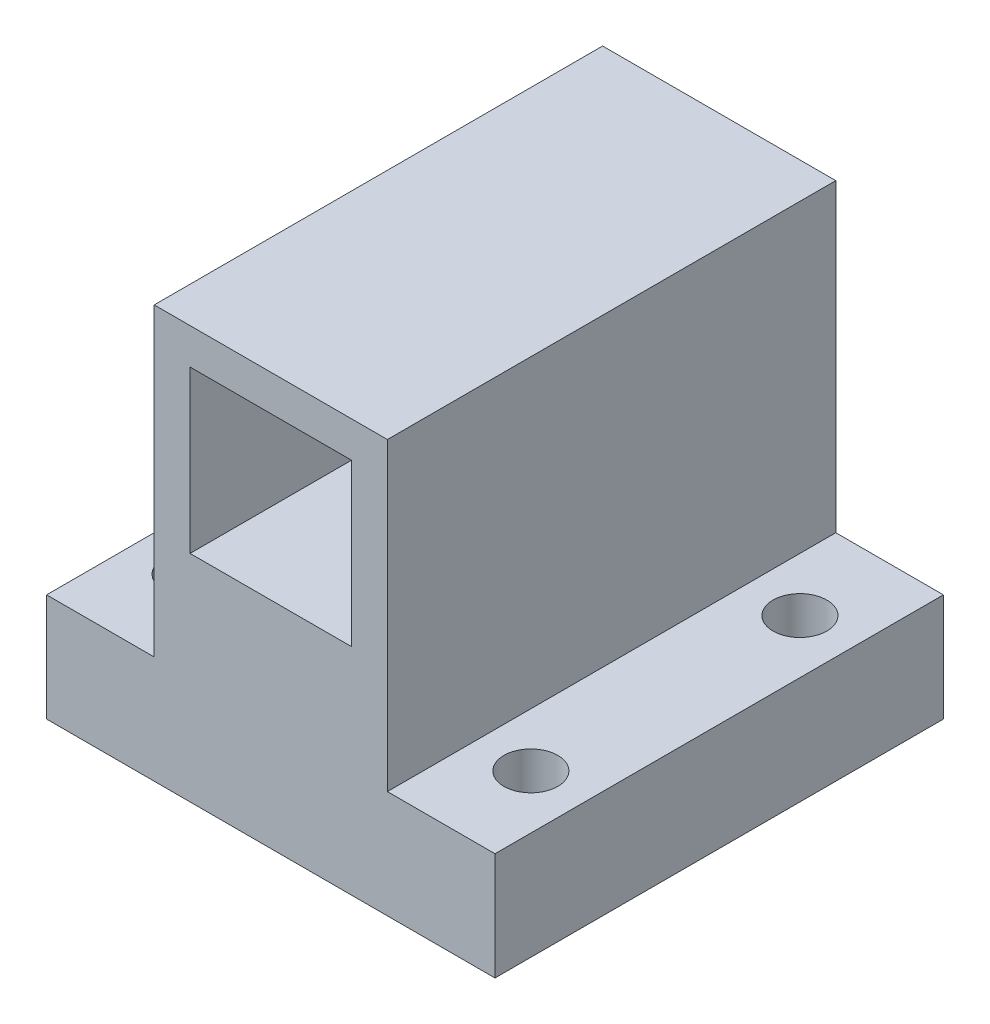
ISO-10303-21;
HEADER;
FILE_DESCRIPTION(('STEP AP214'),'2;1');
FILE_NAME('part.step','',(''),(''),'','','');
FILE_SCHEMA(('AUTOMOTIVE_DESIGN { 1 0 10303 214 1 1 1 1 }'));
ENDSEC;
DATA;
#1=APPLICATION_CONTEXT('core data for automotive mechanical design processes');
#2=APPLICATION_PROTOCOL_DEFINITION('international standard','automotive_design',2000,#1);
#3=PRODUCT_CONTEXT('',#1,'mechanical');
#4=PRODUCT('Part','Part','',(#3));
#5=PRODUCT_RELATED_PRODUCT_CATEGORY('part','',(#4));
#6=PRODUCT_DEFINITION_FORMATION('','',#4);
#7=PRODUCT_DEFINITION_CONTEXT('part definition',#1,'design');
#8=PRODUCT_DEFINITION('design','',#6,#7);
#9=PRODUCT_DEFINITION_SHAPE('','',#8);
#10=(LENGTH_UNIT() NAMED_UNIT(*) SI_UNIT(.MILLI.,.METRE.));
#11=(NAMED_UNIT(*) PLANE_ANGLE_UNIT() SI_UNIT($,.RADIAN.));
#12=(NAMED_UNIT(*) SI_UNIT($,.STERADIAN.) SOLID_ANGLE_UNIT());
#13=UNCERTAINTY_MEASURE_WITH_UNIT(LENGTH_MEASURE(1.E-05),#10,'distance_accuracy_value','');
#14=(GEOMETRIC_REPRESENTATION_CONTEXT(3) GLOBAL_UNCERTAINTY_ASSIGNED_CONTEXT((#13)) GLOBAL_UNIT_ASSIGNED_CONTEXT((#10,
#11,#12)) REPRESENTATION_CONTEXT('',''));
#15=CARTESIAN_POINT('',(0.,0.,0.));
#16=DIRECTION('',(0.,0.,1.));
#17=DIRECTION('',(1.,0.,0.));
#18=AXIS2_PLACEMENT_3D('',#15,#16,#17);
#19=CARTESIAN_POINT('',(0.,0.,0.));
#20=DIRECTION('',(0.,1.,0.));
#21=DIRECTION('',(0.,0.,1.));
#22=AXIS2_PLACEMENT_3D('',#19,#20,#21);
#23=PLANE('',#22);
#24=CARTESIAN_POINT('',(-50.4586617117125,0.,37.4210062958674));
#25=DIRECTION('',(0.,-1.,0.));
#26=DIRECTION('',(0.,0.,1.));
#27=AXIS2_PLACEMENT_3D('',#24,#25,#26);
#28=CIRCLE('',#27,1.5);
#29=CARTESIAN_POINT('',(-50.4586617117125,0.,38.9210062958674));
#30=VERTEX_POINT('',#29);
#31=EDGE_CURVE('E221',#30,#30,#28,.T.);
#32=ORIENTED_EDGE('',*,*,#31,.F.);
#33=EDGE_LOOP('',(#32));
#34=FACE_BOUND('',#33,.T.);
#35=CARTESIAN_POINT('',(-69.4586617117125,0.,52.4210062958674));
#36=DIRECTION('',(0.,1.,0.));
#37=DIRECTION('',(0.,0.,1.));
#38=AXIS2_PLACEMENT_3D('',#35,#36,#37);
#39=CIRCLE('',#38,1.5);
#40=CARTESIAN_POINT('',(-69.4586617117125,0.,53.9210062958674));
#41=VERTEX_POINT('',#40);
#42=EDGE_CURVE('E229',#41,#41,#39,.T.);
#43=ORIENTED_EDGE('',*,*,#42,.T.);
#44=EDGE_LOOP('',(#43));
#45=FACE_BOUND('',#44,.T.);
#46=CARTESIAN_POINT('',(-69.4586617117125,0.,37.4210062958674));
#47=DIRECTION('',(0.,1.,0.));
#48=DIRECTION('',(0.,0.,1.));
#49=AXIS2_PLACEMENT_3D('',#46,#47,#48);
#50=CIRCLE('',#49,1.5);
#51=CARTESIAN_POINT('',(-69.4586617117125,0.,38.9210062958674));
#52=VERTEX_POINT('',#51);
#53=EDGE_CURVE('E237',#52,#52,#50,.T.);
#54=ORIENTED_EDGE('',*,*,#53,.T.);
#55=EDGE_LOOP('',(#54));
#56=FACE_BOUND('',#55,.T.);
#57=DIRECTION('',(0.,0.,-1.));
#58=VECTOR('',#57,1.);
#59=CARTESIAN_POINT('',(-47.4586617117125,0.,32.4210062958674));
#60=LINE('',#59,#58);
#61=CARTESIAN_POINT('',(-47.4586617117125,0.,57.4210062958674));
#62=VERTEX_POINT('',#61);
#63=CARTESIAN_POINT('',(-47.4586617117125,0.,32.4210062958674));
#64=VERTEX_POINT('',#63);
#65=EDGE_CURVE('E266',#62,#64,#60,.T.);
#66=ORIENTED_EDGE('',*,*,#65,.F.);
#67=DIRECTION('',(1.,0.,0.));
#68=VECTOR('',#67,1.);
#69=CARTESIAN_POINT('',(-72.4586617117125,0.,57.4210062958674));
#70=LINE('',#69,#68);
#71=CARTESIAN_POINT('',(-72.4586617117125,0.,57.4210062958674));
#72=VERTEX_POINT('',#71);
#73=EDGE_CURVE('E271',#72,#62,#70,.T.);
#74=ORIENTED_EDGE('',*,*,#73,.F.);
#75=DIRECTION('',(0.,0.,1.));
#76=VECTOR('',#75,1.);
#77=CARTESIAN_POINT('',(-72.4586617117125,0.,32.4210062958674));
#78=LINE('',#77,#76);
#79=CARTESIAN_POINT('',(-72.4586617117125,0.,32.4210062958674));
#80=VERTEX_POINT('',#79);
#81=EDGE_CURVE('E265',#80,#72,#78,.T.);
#82=ORIENTED_EDGE('',*,*,#81,.F.);
#83=DIRECTION('',(-1.,0.,0.));
#84=VECTOR('',#83,1.);
#85=CARTESIAN_POINT('',(-72.4586617117125,0.,32.4210062958674));
#86=LINE('',#85,#84);
#87=EDGE_CURVE('E259',#64,#80,#86,.T.);
#88=ORIENTED_EDGE('',*,*,#87,.F.);
#89=EDGE_LOOP('',(#66,#74,#82,#88));
#90=FACE_BOUND('',#89,.T.);
#91=CARTESIAN_POINT('',(-50.4586617117125,0.,52.4210062958674));
#92=DIRECTION('',(0.,-1.,0.));
#93=DIRECTION('',(0.,0.,1.));
#94=AXIS2_PLACEMENT_3D('',#91,#92,#93);
#95=CIRCLE('',#94,1.5);
#96=CARTESIAN_POINT('',(-50.4586617117125,0.,53.9210062958674));
#97=VERTEX_POINT('',#96);
#98=EDGE_CURVE('E213',#97,#97,#95,.T.);
#99=ORIENTED_EDGE('',*,*,#98,.F.);
#100=EDGE_LOOP('',(#99));
#101=FACE_BOUND('',#100,.T.);
#102=ADVANCED_FACE('F46',(#34,#45,#56,#90,#101),#23,.F.);
#103=CARTESIAN_POINT('',(0.,6.,0.));
#104=DIRECTION('',(0.,-1.,0.));
#105=DIRECTION('',(0.,0.,-1.));
#106=AXIS2_PLACEMENT_3D('',#103,#104,#105);
#107=PLANE('',#106);
#108=CARTESIAN_POINT('',(-50.4586617117125,6.,37.4210062958674));
#109=DIRECTION('',(0.,-1.,0.));
#110=DIRECTION('',(0.,0.,1.));
#111=AXIS2_PLACEMENT_3D('',#108,#109,#110);
#112=CIRCLE('',#111,1.5);
#113=CARTESIAN_POINT('',(-50.4586617117125,6.,38.9210062958674));
#114=VERTEX_POINT('',#113);
#115=EDGE_CURVE('E217',#114,#114,#112,.T.);
#116=ORIENTED_EDGE('',*,*,#115,.T.);
#117=EDGE_LOOP('',(#116));
#118=FACE_BOUND('',#117,.T.);
#119=DIRECTION('',(-1.,0.,0.));
#120=VECTOR('',#119,1.);
#121=CARTESIAN_POINT('',(-53.4586617117125,6.,32.4210062958674));
#122=LINE('',#121,#120);
#123=CARTESIAN_POINT('',(-47.4586617117125,6.,32.4210062958674));
#124=VERTEX_POINT('',#123);
#125=CARTESIAN_POINT('',(-53.4586617117125,6.,32.4210062958674));
#126=VERTEX_POINT('',#125);
#127=EDGE_CURVE('E245',#124,#126,#122,.T.);
#128=ORIENTED_EDGE('',*,*,#127,.T.);
#129=DIRECTION('',(0.,0.,1.));
#130=VECTOR('',#129,1.);
#131=CARTESIAN_POINT('',(-53.4586617117125,6.,57.4210062958674));
#132=LINE('',#131,#130);
#133=CARTESIAN_POINT('',(-53.4586617117125,6.,57.4210062958674));
#134=VERTEX_POINT('',#133);
#135=EDGE_CURVE('E250',#126,#134,#132,.T.);
#136=ORIENTED_EDGE('',*,*,#135,.T.);
#137=DIRECTION('',(1.,0.,0.));
#138=VECTOR('',#137,1.);
#139=CARTESIAN_POINT('',(-47.4586617117125,6.,57.4210062958674));
#140=LINE('',#139,#138);
#141=CARTESIAN_POINT('',(-47.4586617117125,6.,57.4210062958674));
#142=VERTEX_POINT('',#141);
#143=EDGE_CURVE('E346',#134,#142,#140,.T.);
#144=ORIENTED_EDGE('',*,*,#143,.T.);
#145=DIRECTION('',(0.,0.,-1.));
#146=VECTOR('',#145,1.);
#147=CARTESIAN_POINT('',(-47.4586617117125,6.,32.4210062958674));
#148=LINE('',#147,#146);
#149=EDGE_CURVE('E352',#142,#124,#148,.T.);
#150=ORIENTED_EDGE('',*,*,#149,.T.);
#151=EDGE_LOOP('',(#128,#136,#144,#150));
#152=FACE_BOUND('',#151,.T.);
#153=CARTESIAN_POINT('',(-50.4586617117125,6.,52.4210062958674));
#154=DIRECTION('',(0.,-1.,0.));
#155=DIRECTION('',(0.,0.,1.));
#156=AXIS2_PLACEMENT_3D('',#153,#154,#155);
#157=CIRCLE('',#156,1.5);
#158=CARTESIAN_POINT('',(-50.4586617117125,6.,53.9210062958674));
#159=VERTEX_POINT('',#158);
#160=EDGE_CURVE('E207',#159,#159,#157,.T.);
#161=ORIENTED_EDGE('',*,*,#160,.T.);
#162=EDGE_LOOP('',(#161));
#163=FACE_BOUND('',#162,.T.);
#164=ADVANCED_FACE('F362',(#118,#152,#163),#107,.F.);
#165=CARTESIAN_POINT('',(-47.4586617117125,23.,32.4210062958674));
#166=DIRECTION('',(-1.,0.,0.));
#167=DIRECTION('',(0.,0.,1.));
#168=AXIS2_PLACEMENT_3D('',#165,#166,#167);
#169=PLANE('',#168);
#170=DIRECTION('',(0.,-1.,0.));
#171=VECTOR('',#170,1.);
#172=CARTESIAN_POINT('',(-47.4586617117125,23.,32.4210062958674));
#173=LINE('',#172,#171);
#174=EDGE_CURVE('E12',#124,#64,#173,.T.);
#175=ORIENTED_EDGE('',*,*,#174,.F.);
#176=ORIENTED_EDGE('',*,*,#149,.F.);
#177=DIRECTION('',(0.,-1.,0.));
#178=VECTOR('',#177,1.);
#179=CARTESIAN_POINT('',(-47.4586617117125,23.,57.4210062958674));
#180=LINE('',#179,#178);
#181=EDGE_CURVE('E276',#142,#62,#180,.T.);
#182=ORIENTED_EDGE('',*,*,#181,.T.);
#183=ORIENTED_EDGE('',*,*,#65,.T.);
#184=EDGE_LOOP('',(#175,#176,#182,#183));
#185=FACE_BOUND('',#184,.T.);
#186=ADVANCED_FACE('F48',(#185),#169,.F.);
#187=CARTESIAN_POINT('',(-72.4586617117125,23.,32.4210062958674));
#188=DIRECTION('',(0.,0.,1.));
#189=DIRECTION('',(1.,0.,0.));
#190=AXIS2_PLACEMENT_3D('',#187,#188,#189);
#191=PLANE('',#190);
#192=CARTESIAN_POINT('',(-59.9586617117125,16.5,32.4210062958674));
#193=DIRECTION('',(0.,0.,1.));
#194=DIRECTION('',(1.,0.,0.));
#195=AXIS2_PLACEMENT_3D('',#192,#193,#194);
#196=CIRCLE('',#195,3.1);
#197=CARTESIAN_POINT('',(-56.8586617117125,16.5,32.4210062958674));
#198=VERTEX_POINT('',#197);
#199=EDGE_CURVE('E178',#198,#198,#196,.T.);
#200=ORIENTED_EDGE('',*,*,#199,.T.);
#201=EDGE_LOOP('',(#200));
#202=FACE_BOUND('',#201,.T.);
#203=DIRECTION('',(-1.,0.,0.));
#204=VECTOR('',#203,1.);
#205=CARTESIAN_POINT('',(-72.4586617117125,23.,32.4210062958674));
#206=LINE('',#205,#204);
#207=CARTESIAN_POINT('',(-53.4586617117125,23.,32.4210062958674));
#208=VERTEX_POINT('',#207);
#209=CARTESIAN_POINT('',(-66.4586617117125,23.,32.4210062958674));
#210=VERTEX_POINT('',#209);
#211=EDGE_CURVE('E275',#208,#210,#206,.T.);
#212=ORIENTED_EDGE('',*,*,#211,.F.);
#213=DIRECTION('',(0.,1.,0.));
#214=VECTOR('',#213,1.);
#215=CARTESIAN_POINT('',(-53.4586617117125,6.,32.4210062958674));
#216=LINE('',#215,#214);
#217=EDGE_CURVE('E74',#126,#208,#216,.T.);
#218=ORIENTED_EDGE('',*,*,#217,.F.);
#219=ORIENTED_EDGE('',*,*,#127,.F.);
#220=ORIENTED_EDGE('',*,*,#174,.T.);
#221=ORIENTED_EDGE('',*,*,#87,.T.);
#222=DIRECTION('',(0.,-1.,0.));
#223=VECTOR('',#222,1.);
#224=CARTESIAN_POINT('',(-72.4586617117125,23.,32.4210062958674));
#225=LINE('',#224,#223);
#226=CARTESIAN_POINT('',(-72.4586617117125,6.,32.4210062958674));
#227=VERTEX_POINT('',#226);
#228=EDGE_CURVE('E56',#227,#80,#225,.T.);
#229=ORIENTED_EDGE('',*,*,#228,.F.);
#230=DIRECTION('',(-1.,0.,0.));
#231=VECTOR('',#230,1.);
#232=CARTESIAN_POINT('',(-72.4586617117125,6.,32.4210062958674));
#233=LINE('',#232,#231);
#234=CARTESIAN_POINT('',(-66.4586617117125,6.,32.4210062958674));
#235=VERTEX_POINT('',#234);
#236=EDGE_CURVE('E321',#235,#227,#233,.T.);
#237=ORIENTED_EDGE('',*,*,#236,.F.);
#238=DIRECTION('',(0.,1.,0.));
#239=VECTOR('',#238,1.);
#240=CARTESIAN_POINT('',(-66.4586617117125,6.,32.4210062958674));
#241=LINE('',#240,#239);
#242=EDGE_CURVE('E330',#235,#210,#241,.T.);
#243=ORIENTED_EDGE('',*,*,#242,.T.);
#244=EDGE_LOOP('',(#212,#218,#219,#220,#221,#229,#237,#243));
#245=FACE_BOUND('',#244,.T.);
#246=ADVANCED_FACE('F297',(#202,#245),#191,.F.);
#247=CARTESIAN_POINT('',(-72.4586617117125,23.,32.4210062958674));
#248=DIRECTION('',(1.,0.,0.));
#249=DIRECTION('',(0.,0.,-1.));
#250=AXIS2_PLACEMENT_3D('',#247,#248,#249);
#251=PLANE('',#250);
#252=DIRECTION('',(0.,-1.,0.));
#253=VECTOR('',#252,1.);
#254=CARTESIAN_POINT('',(-72.4586617117125,23.,57.4210062958674));
#255=LINE('',#254,#253);
#256=CARTESIAN_POINT('',(-72.4586617117125,6.,57.4210062958674));
#257=VERTEX_POINT('',#256);
#258=EDGE_CURVE('E279',#257,#72,#255,.T.);
#259=ORIENTED_EDGE('',*,*,#258,.F.);
#260=DIRECTION('',(0.,0.,1.));
#261=VECTOR('',#260,1.);
#262=CARTESIAN_POINT('',(-72.4586617117125,6.,57.4210062958674));
#263=LINE('',#262,#261);
#264=EDGE_CURVE('E291',#227,#257,#263,.T.);
#265=ORIENTED_EDGE('',*,*,#264,.F.);
#266=ORIENTED_EDGE('',*,*,#228,.T.);
#267=ORIENTED_EDGE('',*,*,#81,.T.);
#268=EDGE_LOOP('',(#259,#265,#266,#267));
#269=FACE_BOUND('',#268,.T.);
#270=ADVANCED_FACE('F288',(#269),#251,.F.);
#271=CARTESIAN_POINT('',(-72.4586617117125,23.,57.4210062958674));
#272=DIRECTION('',(0.,0.,-1.));
#273=DIRECTION('',(-1.,0.,0.));
#274=AXIS2_PLACEMENT_3D('',#271,#272,#273);
#275=PLANE('',#274);
#276=DIRECTION('',(1.,0.,0.));
#277=VECTOR('',#276,1.);
#278=CARTESIAN_POINT('',(-55.4586617117125,12.,57.4210062958674));
#279=LINE('',#278,#277);
#280=CARTESIAN_POINT('',(-64.4586617117125,12.,57.4210062958674));
#281=VERTEX_POINT('',#280);
#282=CARTESIAN_POINT('',(-55.4586617117125,12.,57.4210062958674));
#283=VERTEX_POINT('',#282);
#284=EDGE_CURVE('E198',#281,#283,#279,.T.);
#285=ORIENTED_EDGE('',*,*,#284,.F.);
#286=DIRECTION('',(0.,-1.,0.));
#287=VECTOR('',#286,1.);
#288=CARTESIAN_POINT('',(-64.4586617117125,12.,57.4210062958674));
#289=LINE('',#288,#287);
#290=CARTESIAN_POINT('',(-64.4586617117125,21.,57.4210062958674));
#291=VERTEX_POINT('',#290);
#292=EDGE_CURVE('E63',#291,#281,#289,.T.);
#293=ORIENTED_EDGE('',*,*,#292,.F.);
#294=DIRECTION('',(-1.,0.,0.));
#295=VECTOR('',#294,1.);
#296=CARTESIAN_POINT('',(-64.4586617117125,21.,57.4210062958674));
#297=LINE('',#296,#295);
#298=CARTESIAN_POINT('',(-55.4586617117125,21.,57.4210062958674));
#299=VERTEX_POINT('',#298);
#300=EDGE_CURVE('E171',#299,#291,#297,.T.);
#301=ORIENTED_EDGE('',*,*,#300,.F.);
#302=DIRECTION('',(0.,1.,0.));
#303=VECTOR('',#302,1.);
#304=CARTESIAN_POINT('',(-55.4586617117125,21.,57.4210062958674));
#305=LINE('',#304,#303);
#306=EDGE_CURVE('E175',#283,#299,#305,.T.);
#307=ORIENTED_EDGE('',*,*,#306,.F.);
#308=EDGE_LOOP('',(#285,#293,#301,#307));
#309=FACE_BOUND('',#308,.T.);
#310=ORIENTED_EDGE('',*,*,#143,.F.);
#311=DIRECTION('',(0.,1.,0.));
#312=VECTOR('',#311,1.);
#313=CARTESIAN_POINT('',(-53.4586617117125,6.,57.4210062958674));
#314=LINE('',#313,#312);
#315=CARTESIAN_POINT('',(-53.4586617117125,23.,57.4210062958674));
#316=VERTEX_POINT('',#315);
#317=EDGE_CURVE('E345',#134,#316,#314,.T.);
#318=ORIENTED_EDGE('',*,*,#317,.T.);
#319=DIRECTION('',(1.,0.,0.));
#320=VECTOR('',#319,1.);
#321=CARTESIAN_POINT('',(-72.4586617117125,23.,57.4210062958674));
#322=LINE('',#321,#320);
#323=CARTESIAN_POINT('',(-66.4586617117125,23.,57.4210062958674));
#324=VERTEX_POINT('',#323);
#325=EDGE_CURVE('E280',#324,#316,#322,.T.);
#326=ORIENTED_EDGE('',*,*,#325,.F.);
#327=DIRECTION('',(0.,1.,0.));
#328=VECTOR('',#327,1.);
#329=CARTESIAN_POINT('',(-66.4586617117125,6.,57.4210062958674));
#330=LINE('',#329,#328);
#331=CARTESIAN_POINT('',(-66.4586617117125,6.,57.4210062958674));
#332=VERTEX_POINT('',#331);
#333=EDGE_CURVE('E313',#332,#324,#330,.T.);
#334=ORIENTED_EDGE('',*,*,#333,.F.);
#335=DIRECTION('',(1.,0.,0.));
#336=VECTOR('',#335,1.);
#337=CARTESIAN_POINT('',(-66.4586617117125,6.,57.4210062958674));
#338=LINE('',#337,#336);
#339=EDGE_CURVE('E311',#257,#332,#338,.T.);
#340=ORIENTED_EDGE('',*,*,#339,.F.);
#341=ORIENTED_EDGE('',*,*,#258,.T.);
#342=ORIENTED_EDGE('',*,*,#73,.T.);
#343=ORIENTED_EDGE('',*,*,#181,.F.);
#344=EDGE_LOOP('',(#310,#318,#326,#334,#340,#341,#342,#343));
#345=FACE_BOUND('',#344,.T.);
#346=ADVANCED_FACE('F307',(#309,#345),#275,.F.);
#347=CARTESIAN_POINT('',(0.,23.,0.));
#348=DIRECTION('',(0.,1.,0.));
#349=DIRECTION('',(0.,0.,1.));
#350=AXIS2_PLACEMENT_3D('',#347,#348,#349);
#351=PLANE('',#350);
#352=DIRECTION('',(0.,0.,1.));
#353=VECTOR('',#352,1.);
#354=CARTESIAN_POINT('',(-53.4586617117125,23.,57.4210062958674));
#355=LINE('',#354,#353);
#356=EDGE_CURVE('E241',#208,#316,#355,.T.);
#357=ORIENTED_EDGE('',*,*,#356,.F.);
#358=ORIENTED_EDGE('',*,*,#211,.T.);
#359=DIRECTION('',(0.,0.,-1.));
#360=VECTOR('',#359,1.);
#361=CARTESIAN_POINT('',(-66.4586617117125,23.,32.4210062958674));
#362=LINE('',#361,#360);
#363=EDGE_CURVE('E323',#324,#210,#362,.T.);
#364=ORIENTED_EDGE('',*,*,#363,.F.);
#365=ORIENTED_EDGE('',*,*,#325,.T.);
#366=EDGE_LOOP('',(#357,#358,#364,#365));
#367=FACE_BOUND('',#366,.T.);
#368=ADVANCED_FACE('F342',(#367),#351,.T.);
#369=CARTESIAN_POINT('',(-66.4586617117125,6.,32.4210062958674));
#370=DIRECTION('',(1.,0.,0.));
#371=DIRECTION('',(0.,0.,-1.));
#372=AXIS2_PLACEMENT_3D('',#369,#370,#371);
#373=PLANE('',#372);
#374=ORIENTED_EDGE('',*,*,#363,.T.);
#375=ORIENTED_EDGE('',*,*,#242,.F.);
#376=DIRECTION('',(0.,0.,-1.));
#377=VECTOR('',#376,1.);
#378=CARTESIAN_POINT('',(-66.4586617117125,6.,32.4210062958674));
#379=LINE('',#378,#377);
#380=EDGE_CURVE('E317',#332,#235,#379,.T.);
#381=ORIENTED_EDGE('',*,*,#380,.F.);
#382=ORIENTED_EDGE('',*,*,#333,.T.);
#383=EDGE_LOOP('',(#374,#375,#381,#382));
#384=FACE_BOUND('',#383,.T.);
#385=ADVANCED_FACE('F376',(#384),#373,.F.);
#386=CARTESIAN_POINT('',(0.,6.,0.));
#387=DIRECTION('',(0.,-1.,0.));
#388=DIRECTION('',(0.,0.,-1.));
#389=AXIS2_PLACEMENT_3D('',#386,#387,#388);
#390=PLANE('',#389);
#391=CARTESIAN_POINT('',(-69.4586617117125,6.,52.4210062958674));
#392=DIRECTION('',(0.,1.,0.));
#393=DIRECTION('',(0.,0.,1.));
#394=AXIS2_PLACEMENT_3D('',#391,#392,#393);
#395=CIRCLE('',#394,1.5);
#396=CARTESIAN_POINT('',(-69.4586617117125,6.,53.9210062958674));
#397=VERTEX_POINT('',#396);
#398=EDGE_CURVE('E225',#397,#397,#395,.T.);
#399=ORIENTED_EDGE('',*,*,#398,.F.);
#400=EDGE_LOOP('',(#399));
#401=FACE_BOUND('',#400,.T.);
#402=CARTESIAN_POINT('',(-69.4586617117125,6.,37.4210062958674));
#403=DIRECTION('',(0.,1.,0.));
#404=DIRECTION('',(0.,0.,1.));
#405=AXIS2_PLACEMENT_3D('',#402,#403,#404);
#406=CIRCLE('',#405,1.5);
#407=CARTESIAN_POINT('',(-69.4586617117125,6.,38.9210062958674));
#408=VERTEX_POINT('',#407);
#409=EDGE_CURVE('E233',#408,#408,#406,.T.);
#410=ORIENTED_EDGE('',*,*,#409,.F.);
#411=EDGE_LOOP('',(#410));
#412=FACE_BOUND('',#411,.T.);
#413=ORIENTED_EDGE('',*,*,#264,.T.);
#414=ORIENTED_EDGE('',*,*,#339,.T.);
#415=ORIENTED_EDGE('',*,*,#380,.T.);
#416=ORIENTED_EDGE('',*,*,#236,.T.);
#417=EDGE_LOOP('',(#413,#414,#415,#416));
#418=FACE_BOUND('',#417,.T.);
#419=ADVANCED_FACE('F367',(#401,#412,#418),#390,.F.);
#420=CARTESIAN_POINT('',(-53.4586617117125,6.,57.4210062958674));
#421=DIRECTION('',(-1.,0.,0.));
#422=DIRECTION('',(0.,0.,1.));
#423=AXIS2_PLACEMENT_3D('',#420,#421,#422);
#424=PLANE('',#423);
#425=ORIENTED_EDGE('',*,*,#356,.T.);
#426=ORIENTED_EDGE('',*,*,#317,.F.);
#427=ORIENTED_EDGE('',*,*,#135,.F.);
#428=ORIENTED_EDGE('',*,*,#217,.T.);
#429=EDGE_LOOP('',(#425,#426,#427,#428));
#430=FACE_BOUND('',#429,.T.);
#431=ADVANCED_FACE('F364',(#430),#424,.F.);
#432=CARTESIAN_POINT('',(-69.4586617117125,0.,37.4210062958674));
#433=DIRECTION('',(0.,1.,0.));
#434=DIRECTION('',(0.,0.,1.));
#435=AXIS2_PLACEMENT_3D('',#432,#433,#434);
#436=CYLINDRICAL_SURFACE('',#435,1.5);
#437=ORIENTED_EDGE('',*,*,#53,.F.);
#438=EDGE_LOOP('',(#437));
#439=FACE_BOUND('',#438,.T.);
#440=ORIENTED_EDGE('',*,*,#409,.T.);
#441=EDGE_LOOP('',(#440));
#442=FACE_BOUND('',#441,.T.);
#443=ADVANCED_FACE('F366',(#439,#442),#436,.F.);
#444=CARTESIAN_POINT('',(-69.4586617117125,0.,52.4210062958674));
#445=DIRECTION('',(0.,1.,0.));
#446=DIRECTION('',(0.,0.,1.));
#447=AXIS2_PLACEMENT_3D('',#444,#445,#446);
#448=CYLINDRICAL_SURFACE('',#447,1.5);
#449=ORIENTED_EDGE('',*,*,#42,.F.);
#450=EDGE_LOOP('',(#449));
#451=FACE_BOUND('',#450,.T.);
#452=ORIENTED_EDGE('',*,*,#398,.T.);
#453=EDGE_LOOP('',(#452));
#454=FACE_BOUND('',#453,.T.);
#455=ADVANCED_FACE('F373',(#451,#454),#448,.F.);
#456=CARTESIAN_POINT('',(-50.4586617117125,0.,37.4210062958674));
#457=DIRECTION('',(0.,1.,0.));
#458=DIRECTION('',(0.,0.,1.));
#459=AXIS2_PLACEMENT_3D('',#456,#457,#458);
#460=CYLINDRICAL_SURFACE('',#459,1.5);
#461=ORIENTED_EDGE('',*,*,#31,.T.);
#462=EDGE_LOOP('',(#461));
#463=FACE_BOUND('',#462,.T.);
#464=ORIENTED_EDGE('',*,*,#115,.F.);
#465=EDGE_LOOP('',(#464));
#466=FACE_BOUND('',#465,.T.);
#467=ADVANCED_FACE('F436',(#463,#466),#460,.F.);
#468=CARTESIAN_POINT('',(-50.4586617117125,0.,52.4210062958674));
#469=DIRECTION('',(0.,1.,0.));
#470=DIRECTION('',(0.,0.,1.));
#471=AXIS2_PLACEMENT_3D('',#468,#469,#470);
#472=CYLINDRICAL_SURFACE('',#471,1.5);
#473=ORIENTED_EDGE('',*,*,#98,.T.);
#474=EDGE_LOOP('',(#473));
#475=FACE_BOUND('',#474,.T.);
#476=ORIENTED_EDGE('',*,*,#160,.F.);
#477=EDGE_LOOP('',(#476));
#478=FACE_BOUND('',#477,.T.);
#479=ADVANCED_FACE('F433',(#475,#478),#472,.F.);
#480=CARTESIAN_POINT('',(-64.4586617117125,12.,34.4210062958674));
#481=DIRECTION('',(-1.,0.,0.));
#482=DIRECTION('',(0.,0.,1.));
#483=AXIS2_PLACEMENT_3D('',#480,#481,#482);
#484=PLANE('',#483);
#485=ORIENTED_EDGE('',*,*,#292,.T.);
#486=DIRECTION('',(0.,0.,1.));
#487=VECTOR('',#486,1.);
#488=CARTESIAN_POINT('',(-64.4586617117125,12.,34.4210062958674));
#489=LINE('',#488,#487);
#490=CARTESIAN_POINT('',(-64.4586617117125,12.,34.4210062958674));
#491=VERTEX_POINT('',#490);
#492=EDGE_CURVE('E146',#491,#281,#489,.T.);
#493=ORIENTED_EDGE('',*,*,#492,.F.);
#494=DIRECTION('',(0.,-1.,0.));
#495=VECTOR('',#494,1.);
#496=CARTESIAN_POINT('',(-64.4586617117125,12.,34.4210062958674));
#497=LINE('',#496,#495);
#498=CARTESIAN_POINT('',(-64.4586617117125,21.,34.4210062958674));
#499=VERTEX_POINT('',#498);
#500=EDGE_CURVE('E150',#499,#491,#497,.T.);
#501=ORIENTED_EDGE('',*,*,#500,.F.);
#502=DIRECTION('',(0.,0.,1.));
#503=VECTOR('',#502,1.);
#504=CARTESIAN_POINT('',(-64.4586617117125,21.,34.4210062958674));
#505=LINE('',#504,#503);
#506=EDGE_CURVE('E204',#499,#291,#505,.T.);
#507=ORIENTED_EDGE('',*,*,#506,.T.);
#508=EDGE_LOOP('',(#485,#493,#501,#507));
#509=FACE_BOUND('',#508,.T.);
#510=ADVANCED_FACE('F148',(#509),#484,.F.);
#511=CARTESIAN_POINT('',(-64.4586617117125,21.,34.4210062958674));
#512=DIRECTION('',(0.,1.,0.));
#513=DIRECTION('',(0.,0.,1.));
#514=AXIS2_PLACEMENT_3D('',#511,#512,#513);
#515=PLANE('',#514);
#516=ORIENTED_EDGE('',*,*,#300,.T.);
#517=ORIENTED_EDGE('',*,*,#506,.F.);
#518=DIRECTION('',(-1.,0.,0.));
#519=VECTOR('',#518,1.);
#520=CARTESIAN_POINT('',(-64.4586617117125,21.,34.4210062958674));
#521=LINE('',#520,#519);
#522=CARTESIAN_POINT('',(-55.4586617117125,21.,34.4210062958674));
#523=VERTEX_POINT('',#522);
#524=EDGE_CURVE('E157',#523,#499,#521,.T.);
#525=ORIENTED_EDGE('',*,*,#524,.F.);
#526=DIRECTION('',(0.,0.,1.));
#527=VECTOR('',#526,1.);
#528=CARTESIAN_POINT('',(-55.4586617117125,21.,34.4210062958674));
#529=LINE('',#528,#527);
#530=EDGE_CURVE('E208',#523,#299,#529,.T.);
#531=ORIENTED_EDGE('',*,*,#530,.T.);
#532=EDGE_LOOP('',(#516,#517,#525,#531));
#533=FACE_BOUND('',#532,.T.);
#534=ADVANCED_FACE('F424',(#533),#515,.F.);
#535=CARTESIAN_POINT('',(-55.4586617117125,21.,34.4210062958674));
#536=DIRECTION('',(1.,0.,0.));
#537=DIRECTION('',(0.,0.,-1.));
#538=AXIS2_PLACEMENT_3D('',#535,#536,#537);
#539=PLANE('',#538);
#540=ORIENTED_EDGE('',*,*,#306,.T.);
#541=ORIENTED_EDGE('',*,*,#530,.F.);
#542=DIRECTION('',(0.,1.,0.));
#543=VECTOR('',#542,1.);
#544=CARTESIAN_POINT('',(-55.4586617117125,21.,34.4210062958674));
#545=LINE('',#544,#543);
#546=CARTESIAN_POINT('',(-55.4586617117125,12.,34.4210062958674));
#547=VERTEX_POINT('',#546);
#548=EDGE_CURVE('E166',#547,#523,#545,.T.);
#549=ORIENTED_EDGE('',*,*,#548,.F.);
#550=DIRECTION('',(0.,0.,1.));
#551=VECTOR('',#550,1.);
#552=CARTESIAN_POINT('',(-55.4586617117125,12.,34.4210062958674));
#553=LINE('',#552,#551);
#554=EDGE_CURVE('E156',#547,#283,#553,.T.);
#555=ORIENTED_EDGE('',*,*,#554,.T.);
#556=EDGE_LOOP('',(#540,#541,#549,#555));
#557=FACE_BOUND('',#556,.T.);
#558=ADVANCED_FACE('F421',(#557),#539,.F.);
#559=CARTESIAN_POINT('',(-55.4586617117125,12.,34.4210062958674));
#560=DIRECTION('',(0.,-1.,0.));
#561=DIRECTION('',(0.,0.,-1.));
#562=AXIS2_PLACEMENT_3D('',#559,#560,#561);
#563=PLANE('',#562);
#564=ORIENTED_EDGE('',*,*,#284,.T.);
#565=ORIENTED_EDGE('',*,*,#554,.F.);
#566=DIRECTION('',(1.,0.,0.));
#567=VECTOR('',#566,1.);
#568=CARTESIAN_POINT('',(-55.4586617117125,12.,34.4210062958674));
#569=LINE('',#568,#567);
#570=EDGE_CURVE('E160',#491,#547,#569,.T.);
#571=ORIENTED_EDGE('',*,*,#570,.F.);
#572=ORIENTED_EDGE('',*,*,#492,.T.);
#573=EDGE_LOOP('',(#564,#565,#571,#572));
#574=FACE_BOUND('',#573,.T.);
#575=ADVANCED_FACE('F161',(#574),#563,.F.);
#576=CARTESIAN_POINT('',(0.,0.,34.4210062958674));
#577=DIRECTION('',(0.,0.,-1.));
#578=DIRECTION('',(-1.,0.,0.));
#579=AXIS2_PLACEMENT_3D('',#576,#577,#578);
#580=PLANE('',#579);
#581=CARTESIAN_POINT('',(-59.9586617117125,16.5,34.4210062958674));
#582=DIRECTION('',(0.,0.,1.));
#583=DIRECTION('',(1.,0.,0.));
#584=AXIS2_PLACEMENT_3D('',#581,#582,#583);
#585=CIRCLE('',#584,3.1);
#586=CARTESIAN_POINT('',(-56.8586617117125,16.5,34.4210062958674));
#587=VERTEX_POINT('',#586);
#588=EDGE_CURVE('E407',#587,#587,#585,.T.);
#589=ORIENTED_EDGE('',*,*,#588,.F.);
#590=EDGE_LOOP('',(#589));
#591=FACE_BOUND('',#590,.T.);
#592=ORIENTED_EDGE('',*,*,#500,.T.);
#593=ORIENTED_EDGE('',*,*,#570,.T.);
#594=ORIENTED_EDGE('',*,*,#548,.T.);
#595=ORIENTED_EDGE('',*,*,#524,.T.);
#596=EDGE_LOOP('',(#592,#593,#594,#595));
#597=FACE_BOUND('',#596,.T.);
#598=ADVANCED_FACE('F168',(#591,#597),#580,.F.);
#599=CARTESIAN_POINT('',(-59.9586617117125,16.5,11.4210062958674));
#600=DIRECTION('',(0.,0.,1.));
#601=DIRECTION('',(1.,0.,0.));
#602=AXIS2_PLACEMENT_3D('',#599,#600,#601);
#603=CYLINDRICAL_SURFACE('',#602,3.1);
#604=ORIENTED_EDGE('',*,*,#588,.T.);
#605=EDGE_LOOP('',(#604));
#606=FACE_BOUND('',#605,.T.);
#607=ORIENTED_EDGE('',*,*,#199,.F.);
#608=EDGE_LOOP('',(#607));
#609=FACE_BOUND('',#608,.T.);
#610=ADVANCED_FACE('F412',(#606,#609),#603,.F.);
#611=CLOSED_SHELL('',(#102,#164,#186,#246,#270,#346,#368,#385,#419,#431,#443,#455,#467,#479,
#510,#534,#558,#575,#598,#610));
#612=MANIFOLD_SOLID_BREP('B2',#611);
#613=ADVANCED_BREP_SHAPE_REPRESENTATION('',(#18,#612),#14);
#614=SHAPE_DEFINITION_REPRESENTATION(#9,#613);
ENDSEC;
END-ISO-10303-21;
